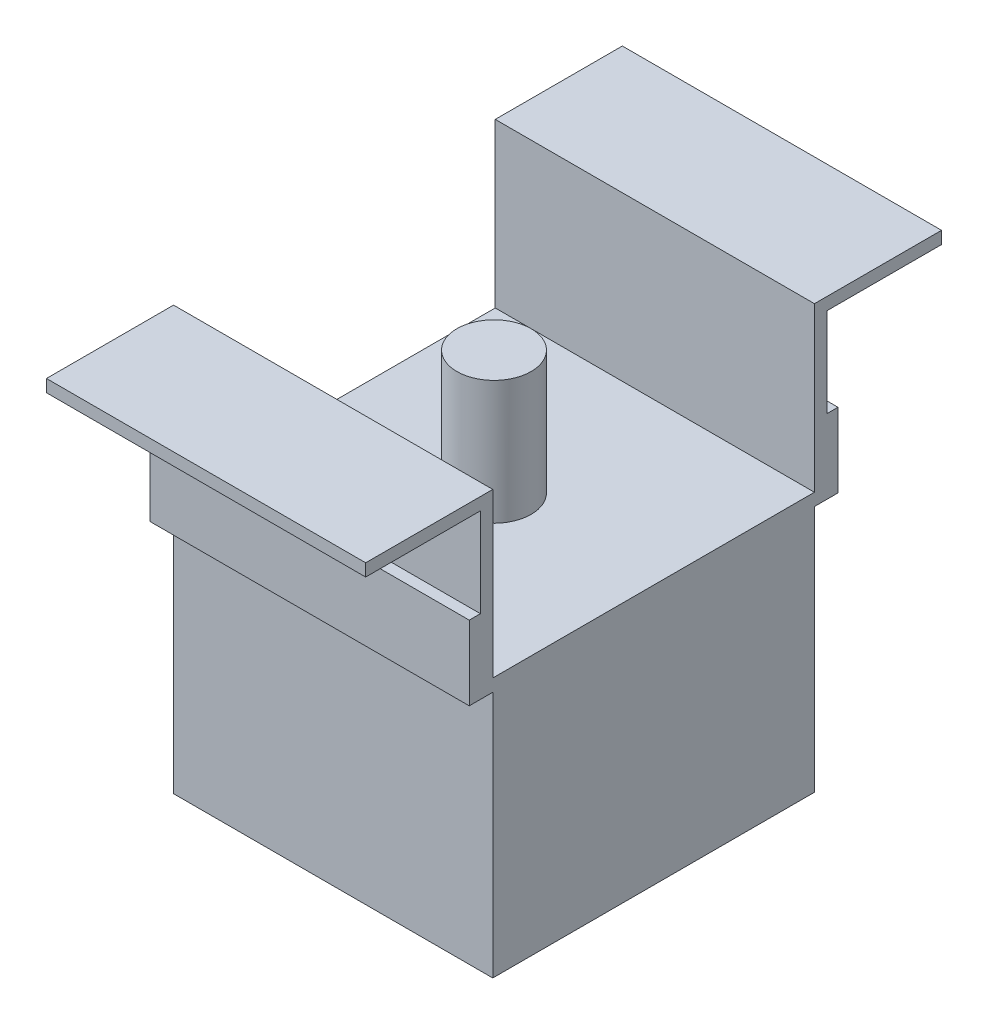
ISO-10303-21;
HEADER;
FILE_DESCRIPTION(('STEP AP214'),'2;1');
FILE_NAME('part.step','',(''),(''),'','','');
FILE_SCHEMA(('AUTOMOTIVE_DESIGN { 1 0 10303 214 1 1 1 1 }'));
ENDSEC;
DATA;
#1=APPLICATION_CONTEXT('core data for automotive mechanical design processes');
#2=APPLICATION_PROTOCOL_DEFINITION('international standard','automotive_design',2000,#1);
#3=PRODUCT_CONTEXT('',#1,'mechanical');
#4=PRODUCT('Part','Part','',(#3));
#5=PRODUCT_RELATED_PRODUCT_CATEGORY('part','',(#4));
#6=PRODUCT_DEFINITION_FORMATION('','',#4);
#7=PRODUCT_DEFINITION_CONTEXT('part definition',#1,'design');
#8=PRODUCT_DEFINITION('design','',#6,#7);
#9=PRODUCT_DEFINITION_SHAPE('','',#8);
#10=(LENGTH_UNIT() NAMED_UNIT(*) SI_UNIT(.MILLI.,.METRE.));
#11=(NAMED_UNIT(*) PLANE_ANGLE_UNIT() SI_UNIT($,.RADIAN.));
#12=(NAMED_UNIT(*) SI_UNIT($,.STERADIAN.) SOLID_ANGLE_UNIT());
#13=UNCERTAINTY_MEASURE_WITH_UNIT(LENGTH_MEASURE(1.E-05),#10,'distance_accuracy_value','');
#14=(GEOMETRIC_REPRESENTATION_CONTEXT(3) GLOBAL_UNCERTAINTY_ASSIGNED_CONTEXT((#13)) GLOBAL_UNIT_ASSIGNED_CONTEXT((#10,
#11,#12)) REPRESENTATION_CONTEXT('',''));
#15=CARTESIAN_POINT('',(0.,0.,0.));
#16=DIRECTION('',(0.,0.,1.));
#17=DIRECTION('',(1.,0.,0.));
#18=AXIS2_PLACEMENT_3D('',#15,#16,#17);
#19=CARTESIAN_POINT('',(0.,10.,0.));
#20=DIRECTION('',(1.,0.,0.));
#21=DIRECTION('',(0.,0.,-1.));
#22=AXIS2_PLACEMENT_3D('',#19,#20,#21);
#23=PLANE('',#22);
#24=DIRECTION('',(0.,0.,1.));
#25=VECTOR('',#24,1.);
#26=CARTESIAN_POINT('',(0.,0.,0.));
#27=LINE('',#26,#25);
#28=CARTESIAN_POINT('',(0.,0.,-13.));
#29=VERTEX_POINT('',#28);
#30=CARTESIAN_POINT('',(0.,0.,0.));
#31=VERTEX_POINT('',#30);
#32=EDGE_CURVE('E308',#29,#31,#27,.T.);
#33=ORIENTED_EDGE('',*,*,#32,.T.);
#34=DIRECTION('',(0.,-1.,0.));
#35=VECTOR('',#34,1.);
#36=CARTESIAN_POINT('',(0.,10.,0.));
#37=LINE('',#36,#35);
#38=CARTESIAN_POINT('',(0.,10.,0.));
#39=VERTEX_POINT('',#38);
#40=EDGE_CURVE('E40',#39,#31,#37,.T.);
#41=ORIENTED_EDGE('',*,*,#40,.F.);
#42=DIRECTION('',(0.,0.,-1.));
#43=VECTOR('',#42,1.);
#44=CARTESIAN_POINT('',(0.,10.,0.));
#45=LINE('',#44,#43);
#46=CARTESIAN_POINT('',(0.,10.,0.950000000000002));
#47=VERTEX_POINT('',#46);
#48=EDGE_CURVE('E237',#47,#39,#45,.T.);
#49=ORIENTED_EDGE('',*,*,#48,.F.);
#50=DIRECTION('',(0.,1.,0.));
#51=VECTOR('',#50,1.);
#52=CARTESIAN_POINT('',(0.,10.,0.950000000000002));
#53=LINE('',#52,#51);
#54=CARTESIAN_POINT('',(0.,13.,0.950000000000002));
#55=VERTEX_POINT('',#54);
#56=EDGE_CURVE('E211',#47,#55,#53,.T.);
#57=ORIENTED_EDGE('',*,*,#56,.T.);
#58=DIRECTION('',(0.,0.,-1.));
#59=VECTOR('',#58,1.);
#60=CARTESIAN_POINT('',(0.,13.,0.5));
#61=LINE('',#60,#59);
#62=CARTESIAN_POINT('',(0.,13.,0.5));
#63=VERTEX_POINT('',#62);
#64=EDGE_CURVE('E213',#55,#63,#61,.T.);
#65=ORIENTED_EDGE('',*,*,#64,.T.);
#66=DIRECTION('',(0.,1.,0.));
#67=VECTOR('',#66,1.);
#68=CARTESIAN_POINT('',(0.,0.,0.5));
#69=LINE('',#68,#67);
#70=CARTESIAN_POINT('',(0.,16.6,0.5));
#71=VERTEX_POINT('',#70);
#72=EDGE_CURVE('E235',#63,#71,#69,.T.);
#73=ORIENTED_EDGE('',*,*,#72,.T.);
#74=DIRECTION('',(0.,0.,1.));
#75=VECTOR('',#74,1.);
#76=CARTESIAN_POINT('',(0.,16.6,0.));
#77=LINE('',#76,#75);
#78=CARTESIAN_POINT('',(0.,16.6,5.13599910420708));
#79=VERTEX_POINT('',#78);
#80=EDGE_CURVE('E233',#71,#79,#77,.T.);
#81=ORIENTED_EDGE('',*,*,#80,.T.);
#82=DIRECTION('',(0.,1.,0.));
#83=VECTOR('',#82,1.);
#84=CARTESIAN_POINT('',(0.,0.,5.13599910420708));
#85=LINE('',#84,#83);
#86=CARTESIAN_POINT('',(0.,17.1,5.13599910420708));
#87=VERTEX_POINT('',#86);
#88=EDGE_CURVE('E230',#79,#87,#85,.T.);
#89=ORIENTED_EDGE('',*,*,#88,.T.);
#90=DIRECTION('',(0.,0.,-1.));
#91=VECTOR('',#90,1.);
#92=CARTESIAN_POINT('',(0.,17.1,0.));
#93=LINE('',#92,#91);
#94=CARTESIAN_POINT('',(0.,17.1,0.));
#95=VERTEX_POINT('',#94);
#96=EDGE_CURVE('E228',#87,#95,#93,.T.);
#97=ORIENTED_EDGE('',*,*,#96,.T.);
#98=DIRECTION('',(0.,-1.,0.));
#99=VECTOR('',#98,1.);
#100=CARTESIAN_POINT('',(0.,0.,0.));
#101=LINE('',#100,#99);
#102=CARTESIAN_POINT('',(0.,10.5,0.));
#103=VERTEX_POINT('',#102);
#104=EDGE_CURVE('E257',#95,#103,#101,.T.);
#105=ORIENTED_EDGE('',*,*,#104,.T.);
#106=DIRECTION('',(0.,0.,1.));
#107=VECTOR('',#106,1.);
#108=CARTESIAN_POINT('',(0.,10.5,0.));
#109=LINE('',#108,#107);
#110=CARTESIAN_POINT('',(0.,10.5,-13.));
#111=VERTEX_POINT('',#110);
#112=EDGE_CURVE('E254',#111,#103,#109,.T.);
#113=ORIENTED_EDGE('',*,*,#112,.F.);
#114=DIRECTION('',(0.,-1.,0.));
#115=VECTOR('',#114,1.);
#116=CARTESIAN_POINT('',(0.,0.,-13.));
#117=LINE('',#116,#115);
#118=CARTESIAN_POINT('',(0.,17.1,-13.));
#119=VERTEX_POINT('',#118);
#120=EDGE_CURVE('E251',#119,#111,#117,.T.);
#121=ORIENTED_EDGE('',*,*,#120,.F.);
#122=DIRECTION('',(0.,0.,1.));
#123=VECTOR('',#122,1.);
#124=CARTESIAN_POINT('',(0.,17.1,0.));
#125=LINE('',#124,#123);
#126=CARTESIAN_POINT('',(0.,17.1,-18.1359991042071));
#127=VERTEX_POINT('',#126);
#128=EDGE_CURVE('E248',#127,#119,#125,.T.);
#129=ORIENTED_EDGE('',*,*,#128,.F.);
#130=DIRECTION('',(0.,1.,0.));
#131=VECTOR('',#130,1.);
#132=CARTESIAN_POINT('',(0.,0.,-18.1359991042071));
#133=LINE('',#132,#131);
#134=CARTESIAN_POINT('',(0.,16.6,-18.1359991042071));
#135=VERTEX_POINT('',#134);
#136=EDGE_CURVE('E245',#135,#127,#133,.T.);
#137=ORIENTED_EDGE('',*,*,#136,.F.);
#138=DIRECTION('',(0.,0.,-1.));
#139=VECTOR('',#138,1.);
#140=CARTESIAN_POINT('',(0.,16.6,0.));
#141=LINE('',#140,#139);
#142=CARTESIAN_POINT('',(0.,16.6,-13.5));
#143=VERTEX_POINT('',#142);
#144=EDGE_CURVE('E242',#143,#135,#141,.T.);
#145=ORIENTED_EDGE('',*,*,#144,.F.);
#146=DIRECTION('',(0.,1.,0.));
#147=VECTOR('',#146,1.);
#148=CARTESIAN_POINT('',(0.,0.,-13.5));
#149=LINE('',#148,#147);
#150=CARTESIAN_POINT('',(0.,13.,-13.5));
#151=VERTEX_POINT('',#150);
#152=EDGE_CURVE('E240',#151,#143,#149,.T.);
#153=ORIENTED_EDGE('',*,*,#152,.F.);
#154=DIRECTION('',(0.,0.,-1.));
#155=VECTOR('',#154,1.);
#156=CARTESIAN_POINT('',(0.,13.,-13.5));
#157=LINE('',#156,#155);
#158=CARTESIAN_POINT('',(0.,13.,-13.95));
#159=VERTEX_POINT('',#158);
#160=EDGE_CURVE('E204',#151,#159,#157,.T.);
#161=ORIENTED_EDGE('',*,*,#160,.T.);
#162=DIRECTION('',(0.,-1.,0.));
#163=VECTOR('',#162,1.);
#164=CARTESIAN_POINT('',(0.,10.,-13.95));
#165=LINE('',#164,#163);
#166=CARTESIAN_POINT('',(0.,10.,-13.95));
#167=VERTEX_POINT('',#166);
#168=EDGE_CURVE('E209',#159,#167,#165,.T.);
#169=ORIENTED_EDGE('',*,*,#168,.T.);
#170=CARTESIAN_POINT('',(0.,10.,-13.));
#171=VERTEX_POINT('',#170);
#172=EDGE_CURVE('E189',#171,#167,#45,.T.);
#173=ORIENTED_EDGE('',*,*,#172,.F.);
#174=DIRECTION('',(0.,-1.,0.));
#175=VECTOR('',#174,1.);
#176=CARTESIAN_POINT('',(0.,10.,-13.));
#177=LINE('',#176,#175);
#178=EDGE_CURVE('E315',#171,#29,#177,.T.);
#179=ORIENTED_EDGE('',*,*,#178,.T.);
#180=EDGE_LOOP('',(#33,#41,#49,#57,#65,#73,#81,#89,#97,#105,#113,#121,#129,#137,#145,#153,#161,
#169,#173,#179));
#181=FACE_BOUND('',#180,.T.);
#182=ADVANCED_FACE('F33',(#181),#23,.F.);
#183=CARTESIAN_POINT('',(0.,10.,0.));
#184=DIRECTION('',(0.,0.,-1.));
#185=DIRECTION('',(-1.,0.,0.));
#186=AXIS2_PLACEMENT_3D('',#183,#184,#185);
#187=PLANE('',#186);
#188=DIRECTION('',(1.,0.,0.));
#189=VECTOR('',#188,1.);
#190=CARTESIAN_POINT('',(0.,0.,0.));
#191=LINE('',#190,#189);
#192=CARTESIAN_POINT('',(12.9,0.,0.));
#193=VERTEX_POINT('',#192);
#194=EDGE_CURVE('E318',#31,#193,#191,.T.);
#195=ORIENTED_EDGE('',*,*,#194,.T.);
#196=DIRECTION('',(0.,-1.,0.));
#197=VECTOR('',#196,1.);
#198=CARTESIAN_POINT('',(12.9,10.,0.));
#199=LINE('',#198,#197);
#200=CARTESIAN_POINT('',(12.9,10.,0.));
#201=VERTEX_POINT('',#200);
#202=EDGE_CURVE('E326',#201,#193,#199,.T.);
#203=ORIENTED_EDGE('',*,*,#202,.F.);
#204=DIRECTION('',(1.,0.,0.));
#205=VECTOR('',#204,1.);
#206=CARTESIAN_POINT('',(0.,10.,0.));
#207=LINE('',#206,#205);
#208=EDGE_CURVE('E309',#39,#201,#207,.T.);
#209=ORIENTED_EDGE('',*,*,#208,.F.);
#210=ORIENTED_EDGE('',*,*,#40,.T.);
#211=EDGE_LOOP('',(#195,#203,#209,#210));
#212=FACE_BOUND('',#211,.T.);
#213=ADVANCED_FACE('F331',(#212),#187,.F.);
#214=CARTESIAN_POINT('',(12.9,10.,0.));
#215=DIRECTION('',(-1.,0.,0.));
#216=DIRECTION('',(0.,0.,1.));
#217=AXIS2_PLACEMENT_3D('',#214,#215,#216);
#218=PLANE('',#217);
#219=DIRECTION('',(0.,0.,-1.));
#220=VECTOR('',#219,1.);
#221=CARTESIAN_POINT('',(12.9,0.,0.));
#222=LINE('',#221,#220);
#223=CARTESIAN_POINT('',(12.9,0.,-13.));
#224=VERTEX_POINT('',#223);
#225=EDGE_CURVE('E320',#193,#224,#222,.T.);
#226=ORIENTED_EDGE('',*,*,#225,.T.);
#227=DIRECTION('',(0.,-1.,0.));
#228=VECTOR('',#227,1.);
#229=CARTESIAN_POINT('',(12.9,10.,-13.));
#230=LINE('',#229,#228);
#231=CARTESIAN_POINT('',(12.9,10.,-13.));
#232=VERTEX_POINT('',#231);
#233=EDGE_CURVE('E179',#232,#224,#230,.T.);
#234=ORIENTED_EDGE('',*,*,#233,.F.);
#235=DIRECTION('',(0.,0.,1.));
#236=VECTOR('',#235,1.);
#237=CARTESIAN_POINT('',(12.9,10.,0.));
#238=LINE('',#237,#236);
#239=CARTESIAN_POINT('',(12.9,10.,-13.95));
#240=VERTEX_POINT('',#239);
#241=EDGE_CURVE('E171',#240,#232,#238,.T.);
#242=ORIENTED_EDGE('',*,*,#241,.F.);
#243=DIRECTION('',(0.,1.,0.));
#244=VECTOR('',#243,1.);
#245=CARTESIAN_POINT('',(12.9,10.,-13.95));
#246=LINE('',#245,#244);
#247=CARTESIAN_POINT('',(12.9,13.,-13.95));
#248=VERTEX_POINT('',#247);
#249=EDGE_CURVE('E176',#240,#248,#246,.T.);
#250=ORIENTED_EDGE('',*,*,#249,.T.);
#251=DIRECTION('',(0.,0.,1.));
#252=VECTOR('',#251,1.);
#253=CARTESIAN_POINT('',(12.9,13.,-13.5));
#254=LINE('',#253,#252);
#255=CARTESIAN_POINT('',(12.9,13.,-13.5));
#256=VERTEX_POINT('',#255);
#257=EDGE_CURVE('E194',#248,#256,#254,.T.);
#258=ORIENTED_EDGE('',*,*,#257,.T.);
#259=DIRECTION('',(0.,-1.,0.));
#260=VECTOR('',#259,1.);
#261=CARTESIAN_POINT('',(12.9,0.,-13.5));
#262=LINE('',#261,#260);
#263=CARTESIAN_POINT('',(12.9,16.6,-13.5));
#264=VERTEX_POINT('',#263);
#265=EDGE_CURVE('E47',#264,#256,#262,.T.);
#266=ORIENTED_EDGE('',*,*,#265,.F.);
#267=DIRECTION('',(0.,0.,1.));
#268=VECTOR('',#267,1.);
#269=CARTESIAN_POINT('',(12.9,16.6,0.));
#270=LINE('',#269,#268);
#271=CARTESIAN_POINT('',(12.9,16.6,-18.1359991042071));
#272=VERTEX_POINT('',#271);
#273=EDGE_CURVE('E276',#272,#264,#270,.T.);
#274=ORIENTED_EDGE('',*,*,#273,.F.);
#275=DIRECTION('',(0.,-1.,0.));
#276=VECTOR('',#275,1.);
#277=CARTESIAN_POINT('',(12.9,0.,-18.1359991042071));
#278=LINE('',#277,#276);
#279=CARTESIAN_POINT('',(12.9,17.1,-18.1359991042071));
#280=VERTEX_POINT('',#279);
#281=EDGE_CURVE('E279',#280,#272,#278,.T.);
#282=ORIENTED_EDGE('',*,*,#281,.F.);
#283=DIRECTION('',(0.,0.,-1.));
#284=VECTOR('',#283,1.);
#285=CARTESIAN_POINT('',(12.9,17.1,0.));
#286=LINE('',#285,#284);
#287=CARTESIAN_POINT('',(12.9,17.1,-13.));
#288=VERTEX_POINT('',#287);
#289=EDGE_CURVE('E282',#288,#280,#286,.T.);
#290=ORIENTED_EDGE('',*,*,#289,.F.);
#291=DIRECTION('',(0.,1.,0.));
#292=VECTOR('',#291,1.);
#293=CARTESIAN_POINT('',(12.9,0.,-13.));
#294=LINE('',#293,#292);
#295=CARTESIAN_POINT('',(12.9,10.5,-13.));
#296=VERTEX_POINT('',#295);
#297=EDGE_CURVE('E285',#296,#288,#294,.T.);
#298=ORIENTED_EDGE('',*,*,#297,.F.);
#299=DIRECTION('',(0.,0.,-1.));
#300=VECTOR('',#299,1.);
#301=CARTESIAN_POINT('',(12.9,10.5,0.));
#302=LINE('',#301,#300);
#303=CARTESIAN_POINT('',(12.9,10.5,0.));
#304=VERTEX_POINT('',#303);
#305=EDGE_CURVE('E227',#304,#296,#302,.T.);
#306=ORIENTED_EDGE('',*,*,#305,.F.);
#307=DIRECTION('',(0.,1.,0.));
#308=VECTOR('',#307,1.);
#309=CARTESIAN_POINT('',(12.9,0.,0.));
#310=LINE('',#309,#308);
#311=CARTESIAN_POINT('',(12.9,17.1,0.));
#312=VERTEX_POINT('',#311);
#313=EDGE_CURVE('E260',#304,#312,#310,.T.);
#314=ORIENTED_EDGE('',*,*,#313,.T.);
#315=DIRECTION('',(0.,0.,1.));
#316=VECTOR('',#315,1.);
#317=CARTESIAN_POINT('',(12.9,17.1,0.));
#318=LINE('',#317,#316);
#319=CARTESIAN_POINT('',(12.9,17.1,5.13599910420708));
#320=VERTEX_POINT('',#319);
#321=EDGE_CURVE('E263',#312,#320,#318,.T.);
#322=ORIENTED_EDGE('',*,*,#321,.T.);
#323=DIRECTION('',(0.,-1.,0.));
#324=VECTOR('',#323,1.);
#325=CARTESIAN_POINT('',(12.9,0.,5.13599910420708));
#326=LINE('',#325,#324);
#327=CARTESIAN_POINT('',(12.9,16.6,5.13599910420708));
#328=VERTEX_POINT('',#327);
#329=EDGE_CURVE('E266',#320,#328,#326,.T.);
#330=ORIENTED_EDGE('',*,*,#329,.T.);
#331=DIRECTION('',(0.,0.,-1.));
#332=VECTOR('',#331,1.);
#333=CARTESIAN_POINT('',(12.9,16.6,0.));
#334=LINE('',#333,#332);
#335=CARTESIAN_POINT('',(12.9,16.6,0.5));
#336=VERTEX_POINT('',#335);
#337=EDGE_CURVE('E269',#328,#336,#334,.T.);
#338=ORIENTED_EDGE('',*,*,#337,.T.);
#339=DIRECTION('',(0.,-1.,0.));
#340=VECTOR('',#339,1.);
#341=CARTESIAN_POINT('',(12.9,0.,0.5));
#342=LINE('',#341,#340);
#343=CARTESIAN_POINT('',(12.9,13.,0.5));
#344=VERTEX_POINT('',#343);
#345=EDGE_CURVE('E272',#336,#344,#342,.T.);
#346=ORIENTED_EDGE('',*,*,#345,.T.);
#347=DIRECTION('',(0.,0.,1.));
#348=VECTOR('',#347,1.);
#349=CARTESIAN_POINT('',(12.9,13.,0.5));
#350=LINE('',#349,#348);
#351=CARTESIAN_POINT('',(12.9,13.,0.950000000000002));
#352=VERTEX_POINT('',#351);
#353=EDGE_CURVE('E215',#344,#352,#350,.T.);
#354=ORIENTED_EDGE('',*,*,#353,.T.);
#355=DIRECTION('',(0.,-1.,0.));
#356=VECTOR('',#355,1.);
#357=CARTESIAN_POINT('',(12.9,10.,0.950000000000002));
#358=LINE('',#357,#356);
#359=CARTESIAN_POINT('',(12.9,10.,0.950000000000002));
#360=VERTEX_POINT('',#359);
#361=EDGE_CURVE('E218',#352,#360,#358,.T.);
#362=ORIENTED_EDGE('',*,*,#361,.T.);
#363=EDGE_CURVE('E183',#201,#360,#238,.T.);
#364=ORIENTED_EDGE('',*,*,#363,.F.);
#365=ORIENTED_EDGE('',*,*,#202,.T.);
#366=EDGE_LOOP('',(#226,#234,#242,#250,#258,#266,#274,#282,#290,#298,#306,#314,#322,#330,#338,
#346,#354,#362,#364,#365));
#367=FACE_BOUND('',#366,.T.);
#368=ADVANCED_FACE('F173',(#367),#218,.F.);
#369=CARTESIAN_POINT('',(0.,10.,-13.));
#370=DIRECTION('',(0.,0.,1.));
#371=DIRECTION('',(1.,0.,0.));
#372=AXIS2_PLACEMENT_3D('',#369,#370,#371);
#373=PLANE('',#372);
#374=DIRECTION('',(-1.,0.,0.));
#375=VECTOR('',#374,1.);
#376=CARTESIAN_POINT('',(0.,0.,-13.));
#377=LINE('',#376,#375);
#378=EDGE_CURVE('E313',#224,#29,#377,.T.);
#379=ORIENTED_EDGE('',*,*,#378,.T.);
#380=ORIENTED_EDGE('',*,*,#178,.F.);
#381=DIRECTION('',(-1.,0.,0.));
#382=VECTOR('',#381,1.);
#383=CARTESIAN_POINT('',(0.,10.,-13.));
#384=LINE('',#383,#382);
#385=EDGE_CURVE('E312',#232,#171,#384,.T.);
#386=ORIENTED_EDGE('',*,*,#385,.F.);
#387=ORIENTED_EDGE('',*,*,#233,.T.);
#388=EDGE_LOOP('',(#379,#380,#386,#387));
#389=FACE_BOUND('',#388,.T.);
#390=ADVANCED_FACE('F340',(#389),#373,.F.);
#391=CARTESIAN_POINT('',(0.,0.,0.));
#392=DIRECTION('',(0.,-1.,0.));
#393=DIRECTION('',(0.,0.,-1.));
#394=AXIS2_PLACEMENT_3D('',#391,#392,#393);
#395=PLANE('',#394);
#396=ORIENTED_EDGE('',*,*,#32,.F.);
#397=ORIENTED_EDGE('',*,*,#378,.F.);
#398=ORIENTED_EDGE('',*,*,#225,.F.);
#399=ORIENTED_EDGE('',*,*,#194,.F.);
#400=EDGE_LOOP('',(#396,#397,#398,#399));
#401=FACE_BOUND('',#400,.T.);
#402=ADVANCED_FACE('F336',(#401),#395,.T.);
#403=CARTESIAN_POINT('',(-24.3309658791514,10.,0.));
#404=DIRECTION('',(0.,1.,0.));
#405=DIRECTION('',(0.,0.,1.));
#406=AXIS2_PLACEMENT_3D('',#403,#404,#405);
#407=PLANE('',#406);
#408=ORIENTED_EDGE('',*,*,#48,.T.);
#409=ORIENTED_EDGE('',*,*,#208,.T.);
#410=ORIENTED_EDGE('',*,*,#363,.T.);
#411=DIRECTION('',(1.,0.,0.));
#412=VECTOR('',#411,1.);
#413=CARTESIAN_POINT('',(-3.03356226242351,10.,0.950000000000002));
#414=LINE('',#413,#412);
#415=EDGE_CURVE('E214',#47,#360,#414,.T.);
#416=ORIENTED_EDGE('',*,*,#415,.F.);
#417=EDGE_LOOP('',(#408,#409,#410,#416));
#418=FACE_BOUND('',#417,.T.);
#419=ADVANCED_FACE('F397',(#418),#407,.F.);
#420=ORIENTED_EDGE('',*,*,#241,.T.);
#421=ORIENTED_EDGE('',*,*,#385,.T.);
#422=ORIENTED_EDGE('',*,*,#172,.T.);
#423=DIRECTION('',(1.,0.,0.));
#424=VECTOR('',#423,1.);
#425=CARTESIAN_POINT('',(-3.03356226242351,10.,-13.95));
#426=LINE('',#425,#424);
#427=EDGE_CURVE('E186',#167,#240,#426,.T.);
#428=ORIENTED_EDGE('',*,*,#427,.T.);
#429=EDGE_LOOP('',(#420,#421,#422,#428));
#430=FACE_BOUND('',#429,.T.);
#431=ADVANCED_FACE('F187',(#430),#407,.F.);
#432=CARTESIAN_POINT('',(-24.3309658791514,10.5,0.));
#433=DIRECTION('',(0.,-1.,0.));
#434=DIRECTION('',(0.,0.,-1.));
#435=AXIS2_PLACEMENT_3D('',#432,#433,#434);
#436=PLANE('',#435);
#437=CARTESIAN_POINT('',(6.45,10.5,-6.5));
#438=DIRECTION('',(0.,-1.,0.));
#439=DIRECTION('',(0.,0.,-1.));
#440=AXIS2_PLACEMENT_3D('',#437,#438,#439);
#441=CIRCLE('',#440,1.5);
#442=CARTESIAN_POINT('',(6.45,10.5,-8.));
#443=VERTEX_POINT('',#442);
#444=EDGE_CURVE('E11',#443,#443,#441,.F.);
#445=ORIENTED_EDGE('',*,*,#444,.F.);
#446=EDGE_LOOP('',(#445));
#447=FACE_BOUND('',#446,.T.);
#448=DIRECTION('',(1.,0.,0.));
#449=VECTOR('',#448,1.);
#450=CARTESIAN_POINT('',(-24.3309658791514,10.5,-13.));
#451=LINE('',#450,#449);
#452=EDGE_CURVE('E231',#111,#296,#451,.T.);
#453=ORIENTED_EDGE('',*,*,#452,.F.);
#454=ORIENTED_EDGE('',*,*,#112,.T.);
#455=DIRECTION('',(1.,0.,0.));
#456=VECTOR('',#455,1.);
#457=CARTESIAN_POINT('',(-24.3309658791514,10.5,0.));
#458=LINE('',#457,#456);
#459=EDGE_CURVE('E288',#103,#304,#458,.T.);
#460=ORIENTED_EDGE('',*,*,#459,.T.);
#461=ORIENTED_EDGE('',*,*,#305,.T.);
#462=EDGE_LOOP('',(#453,#454,#460,#461));
#463=FACE_BOUND('',#462,.T.);
#464=ADVANCED_FACE('F364',(#447,#463),#436,.F.);
#465=CARTESIAN_POINT('',(-24.3309658791514,0.,-13.));
#466=DIRECTION('',(0.,0.,-1.));
#467=DIRECTION('',(-1.,0.,0.));
#468=AXIS2_PLACEMENT_3D('',#465,#466,#467);
#469=PLANE('',#468);
#470=DIRECTION('',(1.,0.,0.));
#471=VECTOR('',#470,1.);
#472=CARTESIAN_POINT('',(-24.3309658791514,17.1,-13.));
#473=LINE('',#472,#471);
#474=EDGE_CURVE('E290',#119,#288,#473,.T.);
#475=ORIENTED_EDGE('',*,*,#474,.F.);
#476=ORIENTED_EDGE('',*,*,#120,.T.);
#477=ORIENTED_EDGE('',*,*,#452,.T.);
#478=ORIENTED_EDGE('',*,*,#297,.T.);
#479=EDGE_LOOP('',(#475,#476,#477,#478));
#480=FACE_BOUND('',#479,.T.);
#481=ADVANCED_FACE('F420',(#480),#469,.F.);
#482=CARTESIAN_POINT('',(-24.3309658791514,17.1,0.));
#483=DIRECTION('',(0.,-1.,0.));
#484=DIRECTION('',(0.,0.,-1.));
#485=AXIS2_PLACEMENT_3D('',#482,#483,#484);
#486=PLANE('',#485);
#487=DIRECTION('',(1.,0.,0.));
#488=VECTOR('',#487,1.);
#489=CARTESIAN_POINT('',(-24.3309658791514,17.1,-18.1359991042071));
#490=LINE('',#489,#488);
#491=EDGE_CURVE('E292',#127,#280,#490,.T.);
#492=ORIENTED_EDGE('',*,*,#491,.F.);
#493=ORIENTED_EDGE('',*,*,#128,.T.);
#494=ORIENTED_EDGE('',*,*,#474,.T.);
#495=ORIENTED_EDGE('',*,*,#289,.T.);
#496=EDGE_LOOP('',(#492,#493,#494,#495));
#497=FACE_BOUND('',#496,.T.);
#498=ADVANCED_FACE('F356',(#497),#486,.F.);
#499=CARTESIAN_POINT('',(-24.3309658791514,0.,-18.1359991042071));
#500=DIRECTION('',(0.,0.,1.));
#501=DIRECTION('',(1.,0.,0.));
#502=AXIS2_PLACEMENT_3D('',#499,#500,#501);
#503=PLANE('',#502);
#504=DIRECTION('',(1.,0.,0.));
#505=VECTOR('',#504,1.);
#506=CARTESIAN_POINT('',(-24.3309658791514,16.6,-18.1359991042071));
#507=LINE('',#506,#505);
#508=EDGE_CURVE('E294',#135,#272,#507,.T.);
#509=ORIENTED_EDGE('',*,*,#508,.F.);
#510=ORIENTED_EDGE('',*,*,#136,.T.);
#511=ORIENTED_EDGE('',*,*,#491,.T.);
#512=ORIENTED_EDGE('',*,*,#281,.T.);
#513=EDGE_LOOP('',(#509,#510,#511,#512));
#514=FACE_BOUND('',#513,.T.);
#515=ADVANCED_FACE('F353',(#514),#503,.F.);
#516=CARTESIAN_POINT('',(-24.3309658791514,16.6,0.));
#517=DIRECTION('',(0.,1.,0.));
#518=DIRECTION('',(0.,0.,1.));
#519=AXIS2_PLACEMENT_3D('',#516,#517,#518);
#520=PLANE('',#519);
#521=DIRECTION('',(1.,0.,0.));
#522=VECTOR('',#521,1.);
#523=CARTESIAN_POINT('',(-24.3309658791514,16.6,-13.5));
#524=LINE('',#523,#522);
#525=EDGE_CURVE('E296',#143,#264,#524,.T.);
#526=ORIENTED_EDGE('',*,*,#525,.F.);
#527=ORIENTED_EDGE('',*,*,#144,.T.);
#528=ORIENTED_EDGE('',*,*,#508,.T.);
#529=ORIENTED_EDGE('',*,*,#273,.T.);
#530=EDGE_LOOP('',(#526,#527,#528,#529));
#531=FACE_BOUND('',#530,.T.);
#532=ADVANCED_FACE('F349',(#531),#520,.F.);
#533=CARTESIAN_POINT('',(-24.3309658791514,0.,-13.5));
#534=DIRECTION('',(0.,0.,1.));
#535=DIRECTION('',(1.,0.,0.));
#536=AXIS2_PLACEMENT_3D('',#533,#534,#535);
#537=PLANE('',#536);
#538=ORIENTED_EDGE('',*,*,#265,.T.);
#539=DIRECTION('',(1.,0.,0.));
#540=VECTOR('',#539,1.);
#541=CARTESIAN_POINT('',(-3.03356226242351,13.,-13.5));
#542=LINE('',#541,#540);
#543=EDGE_CURVE('E207',#151,#256,#542,.T.);
#544=ORIENTED_EDGE('',*,*,#543,.F.);
#545=ORIENTED_EDGE('',*,*,#152,.T.);
#546=ORIENTED_EDGE('',*,*,#525,.T.);
#547=EDGE_LOOP('',(#538,#544,#545,#546));
#548=FACE_BOUND('',#547,.T.);
#549=ADVANCED_FACE('F430',(#548),#537,.F.);
#550=CARTESIAN_POINT('',(-24.3309658791514,0.,0.5));
#551=DIRECTION('',(0.,0.,1.));
#552=DIRECTION('',(1.,0.,0.));
#553=AXIS2_PLACEMENT_3D('',#550,#551,#552);
#554=PLANE('',#553);
#555=DIRECTION('',(1.,0.,0.));
#556=VECTOR('',#555,1.);
#557=CARTESIAN_POINT('',(-3.03356226242351,13.,0.5));
#558=LINE('',#557,#556);
#559=EDGE_CURVE('E55',#63,#344,#558,.T.);
#560=ORIENTED_EDGE('',*,*,#559,.T.);
#561=ORIENTED_EDGE('',*,*,#345,.F.);
#562=DIRECTION('',(1.,0.,0.));
#563=VECTOR('',#562,1.);
#564=CARTESIAN_POINT('',(-24.3309658791514,16.6,0.5));
#565=LINE('',#564,#563);
#566=EDGE_CURVE('E298',#71,#336,#565,.T.);
#567=ORIENTED_EDGE('',*,*,#566,.F.);
#568=ORIENTED_EDGE('',*,*,#72,.F.);
#569=EDGE_LOOP('',(#560,#561,#567,#568));
#570=FACE_BOUND('',#569,.T.);
#571=ADVANCED_FACE('F387',(#570),#554,.T.);
#572=CARTESIAN_POINT('',(-24.3309658791514,16.6,0.));
#573=DIRECTION('',(0.,-1.,0.));
#574=DIRECTION('',(0.,0.,-1.));
#575=AXIS2_PLACEMENT_3D('',#572,#573,#574);
#576=PLANE('',#575);
#577=ORIENTED_EDGE('',*,*,#80,.F.);
#578=ORIENTED_EDGE('',*,*,#566,.T.);
#579=ORIENTED_EDGE('',*,*,#337,.F.);
#580=DIRECTION('',(1.,0.,0.));
#581=VECTOR('',#580,1.);
#582=CARTESIAN_POINT('',(-24.3309658791514,16.6,5.13599910420708));
#583=LINE('',#582,#581);
#584=EDGE_CURVE('E300',#79,#328,#583,.T.);
#585=ORIENTED_EDGE('',*,*,#584,.F.);
#586=EDGE_LOOP('',(#577,#578,#579,#585));
#587=FACE_BOUND('',#586,.T.);
#588=ADVANCED_FACE('F383',(#587),#576,.T.);
#589=CARTESIAN_POINT('',(-24.3309658791514,0.,5.13599910420708));
#590=DIRECTION('',(0.,0.,1.));
#591=DIRECTION('',(1.,0.,0.));
#592=AXIS2_PLACEMENT_3D('',#589,#590,#591);
#593=PLANE('',#592);
#594=ORIENTED_EDGE('',*,*,#88,.F.);
#595=ORIENTED_EDGE('',*,*,#584,.T.);
#596=ORIENTED_EDGE('',*,*,#329,.F.);
#597=DIRECTION('',(1.,0.,0.));
#598=VECTOR('',#597,1.);
#599=CARTESIAN_POINT('',(-24.3309658791514,17.1,5.13599910420708));
#600=LINE('',#599,#598);
#601=EDGE_CURVE('E302',#87,#320,#600,.T.);
#602=ORIENTED_EDGE('',*,*,#601,.F.);
#603=EDGE_LOOP('',(#594,#595,#596,#602));
#604=FACE_BOUND('',#603,.T.);
#605=ADVANCED_FACE('F378',(#604),#593,.T.);
#606=CARTESIAN_POINT('',(-24.3309658791514,17.1,0.));
#607=DIRECTION('',(0.,1.,0.));
#608=DIRECTION('',(0.,0.,1.));
#609=AXIS2_PLACEMENT_3D('',#606,#607,#608);
#610=PLANE('',#609);
#611=ORIENTED_EDGE('',*,*,#96,.F.);
#612=ORIENTED_EDGE('',*,*,#601,.T.);
#613=ORIENTED_EDGE('',*,*,#321,.F.);
#614=DIRECTION('',(1.,0.,0.));
#615=VECTOR('',#614,1.);
#616=CARTESIAN_POINT('',(-24.3309658791514,17.1,0.));
#617=LINE('',#616,#615);
#618=EDGE_CURVE('E304',#95,#312,#617,.T.);
#619=ORIENTED_EDGE('',*,*,#618,.F.);
#620=EDGE_LOOP('',(#611,#612,#613,#619));
#621=FACE_BOUND('',#620,.T.);
#622=ADVANCED_FACE('F374',(#621),#610,.T.);
#623=CARTESIAN_POINT('',(-24.3309658791514,0.,0.));
#624=DIRECTION('',(0.,0.,-1.));
#625=DIRECTION('',(-1.,0.,0.));
#626=AXIS2_PLACEMENT_3D('',#623,#624,#625);
#627=PLANE('',#626);
#628=ORIENTED_EDGE('',*,*,#104,.F.);
#629=ORIENTED_EDGE('',*,*,#618,.T.);
#630=ORIENTED_EDGE('',*,*,#313,.F.);
#631=ORIENTED_EDGE('',*,*,#459,.F.);
#632=EDGE_LOOP('',(#628,#629,#630,#631));
#633=FACE_BOUND('',#632,.T.);
#634=ADVANCED_FACE('F368',(#633),#627,.T.);
#635=CARTESIAN_POINT('',(-3.03356226242351,10.,0.950000000000002));
#636=DIRECTION('',(0.,0.,1.));
#637=DIRECTION('',(1.,0.,0.));
#638=AXIS2_PLACEMENT_3D('',#635,#636,#637);
#639=PLANE('',#638);
#640=ORIENTED_EDGE('',*,*,#56,.F.);
#641=ORIENTED_EDGE('',*,*,#415,.T.);
#642=ORIENTED_EDGE('',*,*,#361,.F.);
#643=DIRECTION('',(1.,0.,0.));
#644=VECTOR('',#643,1.);
#645=CARTESIAN_POINT('',(-3.03356226242351,13.,0.950000000000002));
#646=LINE('',#645,#644);
#647=EDGE_CURVE('E223',#55,#352,#646,.T.);
#648=ORIENTED_EDGE('',*,*,#647,.F.);
#649=EDGE_LOOP('',(#640,#641,#642,#648));
#650=FACE_BOUND('',#649,.T.);
#651=ADVANCED_FACE('F394',(#650),#639,.T.);
#652=CARTESIAN_POINT('',(-3.03356226242351,13.,0.5));
#653=DIRECTION('',(0.,1.,0.));
#654=DIRECTION('',(0.,0.,1.));
#655=AXIS2_PLACEMENT_3D('',#652,#653,#654);
#656=PLANE('',#655);
#657=ORIENTED_EDGE('',*,*,#64,.F.);
#658=ORIENTED_EDGE('',*,*,#647,.T.);
#659=ORIENTED_EDGE('',*,*,#353,.F.);
#660=ORIENTED_EDGE('',*,*,#559,.F.);
#661=EDGE_LOOP('',(#657,#658,#659,#660));
#662=FACE_BOUND('',#661,.T.);
#663=ADVANCED_FACE('F391',(#662),#656,.T.);
#664=CARTESIAN_POINT('',(-3.03356226242351,13.,-13.5));
#665=DIRECTION('',(0.,1.,0.));
#666=DIRECTION('',(0.,0.,1.));
#667=AXIS2_PLACEMENT_3D('',#664,#665,#666);
#668=PLANE('',#667);
#669=ORIENTED_EDGE('',*,*,#160,.F.);
#670=ORIENTED_EDGE('',*,*,#543,.T.);
#671=ORIENTED_EDGE('',*,*,#257,.F.);
#672=DIRECTION('',(1.,0.,0.));
#673=VECTOR('',#672,1.);
#674=CARTESIAN_POINT('',(-3.03356226242351,13.,-13.95));
#675=LINE('',#674,#673);
#676=EDGE_CURVE('E193',#159,#248,#675,.T.);
#677=ORIENTED_EDGE('',*,*,#676,.F.);
#678=EDGE_LOOP('',(#669,#670,#671,#677));
#679=FACE_BOUND('',#678,.T.);
#680=ADVANCED_FACE('F343',(#679),#668,.T.);
#681=CARTESIAN_POINT('',(-3.03356226242351,10.,-13.95));
#682=DIRECTION('',(0.,0.,-1.));
#683=DIRECTION('',(-1.,0.,0.));
#684=AXIS2_PLACEMENT_3D('',#681,#682,#683);
#685=PLANE('',#684);
#686=ORIENTED_EDGE('',*,*,#168,.F.);
#687=ORIENTED_EDGE('',*,*,#676,.T.);
#688=ORIENTED_EDGE('',*,*,#249,.F.);
#689=ORIENTED_EDGE('',*,*,#427,.F.);
#690=EDGE_LOOP('',(#686,#687,#688,#689));
#691=FACE_BOUND('',#690,.T.);
#692=ADVANCED_FACE('F196',(#691),#685,.T.);
#693=CARTESIAN_POINT('',(6.45,15.5,-6.5));
#694=DIRECTION('',(0.,-1.,0.));
#695=DIRECTION('',(0.,0.,-1.));
#696=AXIS2_PLACEMENT_3D('',#693,#694,#695);
#697=CYLINDRICAL_SURFACE('',#696,1.5);
#698=CARTESIAN_POINT('',(6.45,15.5,-6.5));
#699=DIRECTION('',(0.,1.,0.));
#700=DIRECTION('',(0.,0.,1.));
#701=AXIS2_PLACEMENT_3D('',#698,#699,#700);
#702=CIRCLE('',#701,1.5);
#703=CARTESIAN_POINT('',(6.45,15.5,-5.));
#704=VERTEX_POINT('',#703);
#705=EDGE_CURVE('E198',#704,#704,#702,.T.);
#706=ORIENTED_EDGE('',*,*,#705,.F.);
#707=EDGE_LOOP('',(#706));
#708=FACE_BOUND('',#707,.T.);
#709=ORIENTED_EDGE('',*,*,#444,.T.);
#710=EDGE_LOOP('',(#709));
#711=FACE_BOUND('',#710,.T.);
#712=ADVANCED_FACE('F451',(#708,#711),#697,.T.);
#713=CARTESIAN_POINT('',(6.45,15.5,-6.5));
#714=DIRECTION('',(0.,1.,0.));
#715=DIRECTION('',(0.,0.,1.));
#716=AXIS2_PLACEMENT_3D('',#713,#714,#715);
#717=PLANE('',#716);
#718=ORIENTED_EDGE('',*,*,#705,.T.);
#719=EDGE_LOOP('',(#718));
#720=FACE_BOUND('',#719,.T.);
#721=ADVANCED_FACE('F456',(#720),#717,.T.);
#722=CLOSED_SHELL('',(#182,#213,#368,#390,#402,#419,#431,#464,#481,#498,#515,#532,#549,#571,
#588,#605,#622,#634,#651,#663,#680,#692,#712,#721));
#723=MANIFOLD_SOLID_BREP('B2',#722);
#724=ADVANCED_BREP_SHAPE_REPRESENTATION('',(#18,#723),#14);
#725=SHAPE_DEFINITION_REPRESENTATION(#9,#724);
ENDSEC;
END-ISO-10303-21;
